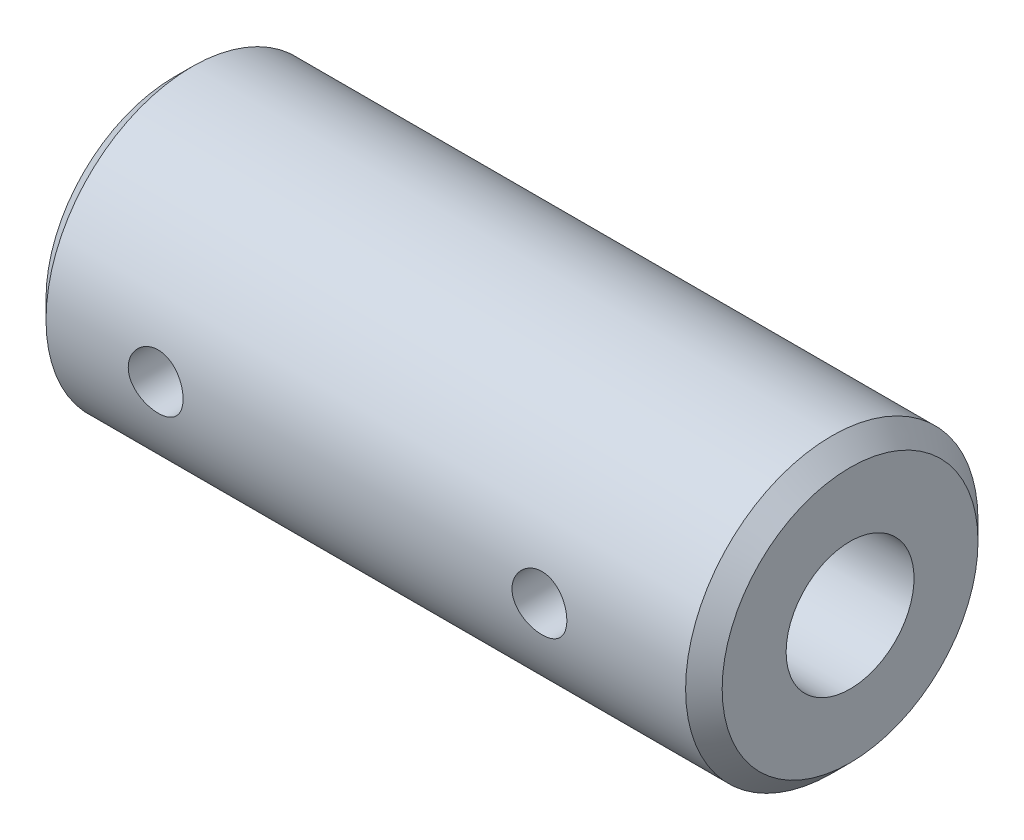
ISO-10303-21;
HEADER;
FILE_DESCRIPTION(('STEP AP214'),'2;1');
FILE_NAME('part.step','',(''),(''),'','','');
FILE_SCHEMA(('AUTOMOTIVE_DESIGN { 1 0 10303 214 1 1 1 1 }'));
ENDSEC;
DATA;
#1=APPLICATION_CONTEXT('core data for automotive mechanical design processes');
#2=APPLICATION_PROTOCOL_DEFINITION('international standard','automotive_design',2000,#1);
#3=PRODUCT_CONTEXT('',#1,'mechanical');
#4=PRODUCT('Part','Part','',(#3));
#5=PRODUCT_RELATED_PRODUCT_CATEGORY('part','',(#4));
#6=PRODUCT_DEFINITION_FORMATION('','',#4);
#7=PRODUCT_DEFINITION_CONTEXT('part definition',#1,'design');
#8=PRODUCT_DEFINITION('design','',#6,#7);
#9=PRODUCT_DEFINITION_SHAPE('','',#8);
#10=(LENGTH_UNIT() NAMED_UNIT(*) SI_UNIT(.MILLI.,.METRE.));
#11=(NAMED_UNIT(*) PLANE_ANGLE_UNIT() SI_UNIT($,.RADIAN.));
#12=(NAMED_UNIT(*) SI_UNIT($,.STERADIAN.) SOLID_ANGLE_UNIT());
#13=UNCERTAINTY_MEASURE_WITH_UNIT(LENGTH_MEASURE(1.E-05),#10,'distance_accuracy_value','');
#14=(GEOMETRIC_REPRESENTATION_CONTEXT(3) GLOBAL_UNCERTAINTY_ASSIGNED_CONTEXT((#13)) GLOBAL_UNIT_ASSIGNED_CONTEXT((#10,
#11,#12)) REPRESENTATION_CONTEXT('',''));
#15=CARTESIAN_POINT('',(0.,0.,0.));
#16=DIRECTION('',(0.,0.,1.));
#17=DIRECTION('',(1.,0.,0.));
#18=AXIS2_PLACEMENT_3D('',#15,#16,#17);
#19=CARTESIAN_POINT('',(81.9500000000005,-6.93,0.));
#20=DIRECTION('',(-1.,0.,0.));
#21=DIRECTION('',(0.,0.,1.));
#22=AXIS2_PLACEMENT_3D('',#19,#20,#21);
#23=CYLINDRICAL_SURFACE('',#22,3.5);
#24=CARTESIAN_POINT('',(118.95,-6.93,0.));
#25=DIRECTION('',(-1.,0.,0.));
#26=DIRECTION('',(0.,0.,1.));
#27=AXIS2_PLACEMENT_3D('',#24,#25,#26);
#28=CIRCLE('',#27,3.5);
#29=CARTESIAN_POINT('',(118.95,-6.93,3.5));
#30=VERTEX_POINT('',#29);
#31=EDGE_CURVE('E146',#30,#30,#28,.T.);
#32=ORIENTED_EDGE('',*,*,#31,.F.);
#33=EDGE_LOOP('',(#32));
#34=FACE_BOUND('',#33,.T.);
#35=CARTESIAN_POINT('',(102.7,-6.93,0.));
#36=DIRECTION('',(-1.,0.,0.));
#37=DIRECTION('',(0.,0.,1.));
#38=AXIS2_PLACEMENT_3D('',#35,#36,#37);
#39=CIRCLE('',#38,3.50000000000001);
#40=CARTESIAN_POINT('',(102.7,-6.93,3.50000000000001));
#41=VERTEX_POINT('',#40);
#42=EDGE_CURVE('E55',#41,#41,#39,.T.);
#43=ORIENTED_EDGE('',*,*,#42,.T.);
#44=EDGE_LOOP('',(#43));
#45=FACE_BOUND('',#44,.T.);
#46=CARTESIAN_POINT('',(111.45,-6.93,3.5));
#47=CARTESIAN_POINT('',(111.449990778561,-7.0101521976824,3.49999299268885));
#48=CARTESIAN_POINT('',(111.443537870245,-7.09041999219824,3.49721516409711));
#49=CARTESIAN_POINT('',(111.417960292715,-7.24867161136121,3.48637069204866));
#50=CARTESIAN_POINT('',(111.398803630211,-7.32664914909057,3.47829069608752));
#51=CARTESIAN_POINT('',(111.348664724801,-7.47776816474641,3.45770786336708));
#52=CARTESIAN_POINT('',(111.317723472538,-7.55092538614674,3.44522036823866));
#53=CARTESIAN_POINT('',(111.24506789625,-7.69093644607188,3.4170283792682));
#54=CARTESIAN_POINT('',(111.203356490849,-7.75779198561141,3.4013247572084));
#55=CARTESIAN_POINT('',(111.108036145875,-7.88692078354612,3.36733908702935));
#56=CARTESIAN_POINT('',(111.053952361923,-7.94882024425246,3.34896947381214));
#57=CARTESIAN_POINT('',(110.936428073884,-8.06299518436931,3.3120882776969));
#58=CARTESIAN_POINT('',(110.87298240993,-8.11526532055664,3.29357662187922));
#59=CARTESIAN_POINT('',(110.734483636294,-8.21142843548185,3.25741027462364));
#60=CARTESIAN_POINT('',(110.658994770358,-8.25473406006014,3.23985230076501));
#61=CARTESIAN_POINT('',(110.500945286533,-8.32786599574425,3.2089808436345));
#62=CARTESIAN_POINT('',(110.41838854792,-8.35769964537364,3.19566505070703));
#63=CARTESIAN_POINT('',(110.252849630691,-8.40147459991436,3.17573899533535));
#64=CARTESIAN_POINT('',(110.170096149073,-8.41613747209694,3.16882610719818));
#65=CARTESIAN_POINT('',(110.003037015233,-8.43140303570396,3.1616242484202));
#66=CARTESIAN_POINT('',(109.918732322351,-8.43201414304565,3.16133131294302));
#67=CARTESIAN_POINT('',(109.758350048152,-8.41969999758096,3.16714786968021));
#68=CARTESIAN_POINT('',(109.682164688394,-8.40788056910827,3.17273435527609));
#69=CARTESIAN_POINT('',(109.532986207111,-8.37290386406528,3.18879205821457));
#70=CARTESIAN_POINT('',(109.459993743072,-8.34974426417224,3.19926427650311));
#71=CARTESIAN_POINT('',(109.317376424263,-8.29228829534658,3.22415342810443));
#72=CARTESIAN_POINT('',(109.247859852886,-8.25775987214028,3.23865147551049));
#73=CARTESIAN_POINT('',(109.115326837971,-8.17871152436692,3.26994246945714));
#74=CARTESIAN_POINT('',(109.052313052537,-8.13418753740297,3.28673634798109));
#75=CARTESIAN_POINT('',(108.928611248188,-8.03171702696059,3.32256202266195));
#76=CARTESIAN_POINT('',(108.868641635264,-7.97292364428053,3.34165927694226));
#77=CARTESIAN_POINT('',(108.759164204673,-7.84593666202554,3.3786730287964));
#78=CARTESIAN_POINT('',(108.709659127061,-7.77774060814,3.39658921627429));
#79=CARTESIAN_POINT('',(108.621378033597,-7.63159291150633,3.4297984684468));
#80=CARTESIAN_POINT('',(108.582910490648,-7.55343557485116,3.44501227516836));
#81=CARTESIAN_POINT('',(108.519924881193,-7.39093984707949,3.47048698130307));
#82=CARTESIAN_POINT('',(108.495398647012,-7.30660510782884,3.48075078019998));
#83=CARTESIAN_POINT('',(108.462533069771,-7.14013811947069,3.49461763446686));
#84=CARTESIAN_POINT('',(108.453230617343,-7.05822898050547,3.49861624982293));
#85=CARTESIAN_POINT('',(108.448185211796,-6.89392834944074,3.50077708325871));
#86=CARTESIAN_POINT('',(108.452438073734,-6.8115370140497,3.49894110265834));
#87=CARTESIAN_POINT('',(108.473707816028,-6.6532287801867,3.48989338160076));
#88=CARTESIAN_POINT('',(108.490034160725,-6.57720053424801,3.48297259736824));
#89=CARTESIAN_POINT('',(108.534010447119,-6.42905443180369,3.46476944004987));
#90=CARTESIAN_POINT('',(108.561661797861,-6.35693706314958,3.45348652424257));
#91=CARTESIAN_POINT('',(108.628400579752,-6.21611151738101,3.42719375756865));
#92=CARTESIAN_POINT('',(108.667818165114,-6.14758012524248,3.41207852694256));
#93=CARTESIAN_POINT('',(108.756609472238,-6.01785754717483,3.37971494195702));
#94=CARTESIAN_POINT('',(108.80598744401,-5.95666951242888,3.36246567824313));
#95=CARTESIAN_POINT('',(108.917644793924,-5.83851620234367,3.32607394349024));
#96=CARTESIAN_POINT('',(108.98061610504,-5.78221691225722,3.30688677499574));
#97=CARTESIAN_POINT('',(109.115391149307,-5.68078284275599,3.2699201884485));
#98=CARTESIAN_POINT('',(109.187197330153,-5.63565116779808,3.2521411627736));
#99=CARTESIAN_POINT('',(109.339406926515,-5.55718062193616,3.21981484643716));
#100=CARTESIAN_POINT('',(109.419941504657,-5.52406792526647,3.20533127997695));
#101=CARTESIAN_POINT('',(109.586263163238,-5.47217057449108,3.18206803761104));
#102=CARTESIAN_POINT('',(109.672045498671,-5.4533731775002,3.17328328988835));
#103=CARTESIAN_POINT('',(109.838995586619,-5.43194025916096,3.16321740581936));
#104=CARTESIAN_POINT('',(109.91997963538,-5.42812653833757,3.16138962881681));
#105=CARTESIAN_POINT('',(110.081394871832,-5.43358674914209,3.16397809086752));
#106=CARTESIAN_POINT('',(110.161826154516,-5.44285837251315,3.16839322866984));
#107=CARTESIAN_POINT('',(110.315520853867,-5.47321785900563,3.18245827118031));
#108=CARTESIAN_POINT('',(110.388939416648,-5.49366517986621,3.19182357178318));
#109=CARTESIAN_POINT('',(110.531310362175,-5.54514882999564,3.2144943728719));
#110=CARTESIAN_POINT('',(110.600261468454,-5.57618816993762,3.22780099349553));
#111=CARTESIAN_POINT('',(110.736410436909,-5.65018397772979,3.25787626150962));
#112=CARTESIAN_POINT('',(110.803234893821,-5.69375972287232,3.27480834339631));
#113=CARTESIAN_POINT('',(110.928990863531,-5.79075111118695,3.30979879908541));
#114=CARTESIAN_POINT('',(110.987919377544,-5.84417047465706,3.32785759700648));
#115=CARTESIAN_POINT('',(111.101003097315,-5.96432832445824,3.36477750877144));
#116=CARTESIAN_POINT('',(111.154414733869,-6.03178518201865,3.38358948911939));
#117=CARTESIAN_POINT('',(111.249214926694,-6.17538738629306,3.41848089249469));
#118=CARTESIAN_POINT('',(111.29059803175,-6.25153665061729,3.43455907522588));
#119=CARTESIAN_POINT('',(111.359344569571,-6.40937319710343,3.46197513636855));
#120=CARTESIAN_POINT('',(111.38690352998,-6.4909635971418,3.47337868320289));
#121=CARTESIAN_POINT('',(111.427634714768,-6.65807434259566,3.49042295491409));
#122=CARTESIAN_POINT('',(111.440851509647,-6.74358164728867,3.49608152963086));
#123=CARTESIAN_POINT('',(111.448880510954,-6.86297323938678,3.49952115812386));
#124=CARTESIAN_POINT('',(111.450003856848,-6.89647650893925,3.50000293079342));
#125=CARTESIAN_POINT('',(111.45,-6.93,3.5));
#126=B_SPLINE_CURVE_WITH_KNOTS('',3,(#46,#47,#48,#49,#50,#51,#52,#53,#54,#55,#56,#57,#58,#59,
#60,#61,#62,#63,#64,#65,#66,#67,#68,#69,#70,#71,#72,#73,#74,#75,#76,#77,#78,#79,#80,#81,#82,#83,
#84,#85,#86,#87,#88,#89,#90,#91,#92,#93,#94,#95,#96,#97,#98,#99,#100,#101,#102,#103,#104,#105,
#106,#107,#108,#109,#110,#111,#112,#113,#114,#115,#116,#117,#118,#119,#120,#121,#122,#123,#124,
#125),.UNSPECIFIED.,.T.,.F.,(4,2,2,2,2,2,2,2,2,2,2,2,2,2,2,2,2,2,2,2,2,2,2,2,2,2,2,2,2,2,2,2,2,
2,2,2,2,2,2,4),(0.,0.240357161374422,0.481321951711673,0.72145613137571,0.961525304807653,
1.21311371779253,1.46484131710872,1.72984780430032,1.99470976114132,2.2462971341405,
2.49773382188956,2.72855360159806,2.95942069041214,3.19532704432401,3.43132944942383,
3.6885491885916,3.94583619550722,4.20973622296857,4.47348148178612,4.71978673747255,
4.96601595851025,5.19915597113057,5.43232499957121,5.67277527577343,5.91332836788287,
6.17201425189599,6.43077196675481,6.69417345394932,6.95734019712948,7.19934244432576,
7.44130200762142,7.67066022550941,7.90008369050322,8.14372375039556,8.38745608120074,
8.65042084666957,8.91350460007054,9.17275427816963,9.43119596989051,9.53172485598107),.UNSPECIFIED.);
#127=CARTESIAN_POINT('',(111.45,-6.93,3.5));
#128=VERTEX_POINT('',#127);
#129=EDGE_CURVE('E83',#128,#128,#126,.T.);
#130=ORIENTED_EDGE('',*,*,#129,.F.);
#131=EDGE_LOOP('',(#130));
#132=FACE_BOUND('',#131,.T.);
#133=ADVANCED_FACE('F34',(#34,#45,#132),#23,.F.);
#134=CARTESIAN_POINT('',(81.9500000000005,-6.93,0.));
#135=DIRECTION('',(-1.,0.,0.));
#136=DIRECTION('',(0.,0.,1.));
#137=AXIS2_PLACEMENT_3D('',#134,#135,#136);
#138=CYLINDRICAL_SURFACE('',#137,8.);
#139=CARTESIAN_POINT('',(82.9500000000005,-6.93,0.));
#140=DIRECTION('',(-1.,0.,0.));
#141=DIRECTION('',(0.,0.,1.));
#142=AXIS2_PLACEMENT_3D('',#139,#140,#141);
#143=CIRCLE('',#142,8.);
#144=CARTESIAN_POINT('',(82.9500000000005,-6.93,8.));
#145=VERTEX_POINT('',#144);
#146=EDGE_CURVE('E137',#145,#145,#143,.T.);
#147=ORIENTED_EDGE('',*,*,#146,.F.);
#148=EDGE_LOOP('',(#147));
#149=FACE_BOUND('',#148,.T.);
#150=CARTESIAN_POINT('',(117.95,-6.93,0.));
#151=DIRECTION('',(-1.,0.,0.));
#152=DIRECTION('',(0.,0.,1.));
#153=AXIS2_PLACEMENT_3D('',#150,#151,#152);
#154=CIRCLE('',#153,8.);
#155=CARTESIAN_POINT('',(117.95,-6.93,8.));
#156=VERTEX_POINT('',#155);
#157=EDGE_CURVE('E140',#156,#156,#154,.T.);
#158=ORIENTED_EDGE('',*,*,#157,.T.);
#159=EDGE_LOOP('',(#158));
#160=FACE_BOUND('',#159,.T.);
#161=CARTESIAN_POINT('',(108.45,-6.93,8.));
#162=CARTESIAN_POINT('',(108.450003189589,-7.01347174646547,7.99999848833852));
#163=CARTESIAN_POINT('',(108.45699107662,-7.0969849927301,7.99868009921714));
#164=CARTESIAN_POINT('',(108.484739995119,-7.2616581298418,7.9935478589052));
#165=CARTESIAN_POINT('',(108.50551265064,-7.34281597415223,7.98973190166897));
#166=CARTESIAN_POINT('',(108.56017270126,-7.5003729618518,7.98003138765458));
#167=CARTESIAN_POINT('',(108.594048252453,-7.57677633068535,7.97414869946483));
#168=CARTESIAN_POINT('',(108.673918876923,-7.72280797309401,7.96095710599783));
#169=CARTESIAN_POINT('',(108.719912969145,-7.79243679447732,7.9536483161829));
#170=CARTESIAN_POINT('',(108.823299768004,-7.9237837159305,7.93831336430504));
#171=CARTESIAN_POINT('',(108.880809444671,-7.98540895503183,7.93028034856351));
#172=CARTESIAN_POINT('',(109.005343309088,-8.09819606135369,7.9144531845865));
#173=CARTESIAN_POINT('',(109.07236817977,-8.14935717689241,7.90665905354528));
#174=CARTESIAN_POINT('',(109.214686088364,-8.24014998665793,7.89212551245005));
#175=CARTESIAN_POINT('',(109.290040370318,-8.27968721969605,7.88539493886182));
#176=CARTESIAN_POINT('',(109.446468915177,-8.34550524332283,7.87384713211987));
#177=CARTESIAN_POINT('',(109.527542684112,-8.37178717713098,7.86902973396962));
#178=CARTESIAN_POINT('',(109.692115230915,-8.410050535035,7.8619226957455));
#179=CARTESIAN_POINT('',(109.775575097204,-8.42219390192039,7.85960445366405));
#180=CARTESIAN_POINT('',(109.943377384809,-8.43233808095346,7.85767197152761));
#181=CARTESIAN_POINT('',(110.027719726303,-8.43034016135374,7.8580574889876));
#182=CARTESIAN_POINT('',(110.193719525267,-8.41238979602362,7.86146292701753));
#183=CARTESIAN_POINT('',(110.275397714301,-8.39662149996045,7.86444808147334));
#184=CARTESIAN_POINT('',(110.434928419783,-8.35186799396207,7.87266183284666));
#185=CARTESIAN_POINT('',(110.51278077351,-8.32288222239499,7.87789052509516));
#186=CARTESIAN_POINT('',(110.662988679001,-8.25233647179299,7.89003855292589));
#187=CARTESIAN_POINT('',(110.735308470581,-8.21070213532456,7.89696783823366));
#188=CARTESIAN_POINT('',(110.872004728541,-8.11609368930416,7.91172971602918));
#189=CARTESIAN_POINT('',(110.936380387715,-8.06311842889265,7.91956240015522));
#190=CARTESIAN_POINT('',(111.056424955673,-7.94633905685297,7.93540001272164));
#191=CARTESIAN_POINT('',(111.111940652452,-7.88237743686068,7.94340571024031));
#192=CARTESIAN_POINT('',(111.211477240676,-7.74596803709882,7.95857386108318));
#193=CARTESIAN_POINT('',(111.255498016871,-7.67352017225577,7.96573630595245));
#194=CARTESIAN_POINT('',(111.33081775387,-7.52203498887467,7.97842539677509));
#195=CARTESIAN_POINT('',(111.362100779118,-7.44298956444649,7.98394999136289));
#196=CARTESIAN_POINT('',(111.410902093093,-7.28063911539869,7.99272505402719));
#197=CARTESIAN_POINT('',(111.428421844046,-7.19733454427779,7.99597576367994));
#198=CARTESIAN_POINT('',(111.448986031019,-7.03014865290338,7.99980360641981));
#199=CARTESIAN_POINT('',(111.45224039153,-6.94629401263413,8.00041950912279));
#200=CARTESIAN_POINT('',(111.444744520453,-6.77923875190781,7.99901543598228));
#201=CARTESIAN_POINT('',(111.433994976935,-6.69603809951961,7.99699558964431));
#202=CARTESIAN_POINT('',(111.398970964817,-6.53331842678178,7.99057111500407));
#203=CARTESIAN_POINT('',(111.374802717463,-6.45377573895394,7.98618522374031));
#204=CARTESIAN_POINT('',(111.313742293222,-6.29987136817537,7.97551842212498));
#205=CARTESIAN_POINT('',(111.276849252435,-6.2255100374049,7.96923738311334));
#206=CARTESIAN_POINT('',(111.190921871841,-6.08318332848679,7.95538030357666));
#207=CARTESIAN_POINT('',(111.141759261464,-6.01529672298488,7.94779086174563));
#208=CARTESIAN_POINT('',(111.032861862638,-5.88866167673546,7.93219343489712));
#209=CARTESIAN_POINT('',(110.973126086999,-5.82991409023913,7.92418541084687));
#210=CARTESIAN_POINT('',(110.843827681089,-5.72242704127952,7.9085247569745));
#211=CARTESIAN_POINT('',(110.774145091875,-5.67383083781424,7.90087825860257));
#212=CARTESIAN_POINT('',(110.627482375477,-5.58903324942213,7.88692985578532));
#213=CARTESIAN_POINT('',(110.55050251963,-5.55283140386076,7.8806279013735));
#214=CARTESIAN_POINT('',(110.391794132758,-5.49405326487177,7.87013024209574));
#215=CARTESIAN_POINT('',(110.310090620441,-5.47141131205214,7.86592440436879));
#216=CARTESIAN_POINT('',(110.143952777479,-5.44019320673765,7.86007203802415));
#217=CARTESIAN_POINT('',(110.05951875603,-5.43161546729292,7.8584252206579));
#218=CARTESIAN_POINT('',(109.891751668559,-5.42882237851646,7.85789199803857));
#219=CARTESIAN_POINT('',(109.808422419043,-5.43438104996502,7.85896215974293));
#220=CARTESIAN_POINT('',(109.643908577955,-5.45920824621198,7.86364600659998));
#221=CARTESIAN_POINT('',(109.562723973573,-5.47847668910668,7.86725967655747));
#222=CARTESIAN_POINT('',(109.404925515205,-5.53008112416737,7.8766050802318));
#223=CARTESIAN_POINT('',(109.328303408655,-5.56239264602748,7.88233284594965));
#224=CARTESIAN_POINT('',(109.18153174576,-5.63914131087795,7.8952638755184));
#225=CARTESIAN_POINT('',(109.111382647156,-5.68357931051814,7.90246724360119));
#226=CARTESIAN_POINT('',(108.978416319958,-5.78410512660465,7.91767266107745));
#227=CARTESIAN_POINT('',(108.915724587433,-5.84035740135697,7.92568505353043));
#228=CARTESIAN_POINT('',(108.800594837536,-5.96257207325771,7.94152833918735));
#229=CARTESIAN_POINT('',(108.74815917902,-6.02853669810838,7.94935919027328));
#230=CARTESIAN_POINT('',(108.654589047373,-6.16901505492813,7.96403975968049));
#231=CARTESIAN_POINT('',(108.61356057151,-6.24360040935948,7.97088000990561));
#232=CARTESIAN_POINT('',(108.544682363395,-6.39870988634616,7.98271619380687));
#233=CARTESIAN_POINT('',(108.516820252954,-6.47922834829475,7.98771385879037));
#234=CARTESIAN_POINT('',(108.480722685582,-6.62165279717484,7.99428290707632));
#235=CARTESIAN_POINT('',(108.469221369688,-6.68272618974813,7.99641470878206));
#236=CARTESIAN_POINT('',(108.453858937884,-6.80585875288484,7.9992737995401));
#237=CARTESIAN_POINT('',(108.449997627745,-6.86791789834729,8.00000112429805));
#238=CARTESIAN_POINT('',(108.45,-6.93,8.));
#239=B_SPLINE_CURVE_WITH_KNOTS('',3,(#161,#162,#163,#164,#165,#166,#167,#168,#169,#170,#171,
#172,#173,#174,#175,#176,#177,#178,#179,#180,#181,#182,#183,#184,#185,#186,#187,#188,#189,#190,
#191,#192,#193,#194,#195,#196,#197,#198,#199,#200,#201,#202,#203,#204,#205,#206,#207,#208,#209,
#210,#211,#212,#213,#214,#215,#216,#217,#218,#219,#220,#221,#222,#223,#224,#225,#226,#227,#228,
#229,#230,#231,#232,#233,#234,#235,#236,#237,#238),.UNSPECIFIED.,.T.,.F.,(4,2,2,2,2,2,2,2,2,2,2,
2,2,2,2,2,2,2,2,2,2,2,2,2,2,2,2,2,2,2,2,2,2,2,2,2,2,2,4),(0.,0.250188200964927,
0.500587642535452,0.750761271230909,1.00091465336891,1.2537511801363,1.50660586283616,
1.76146190504357,2.01629596311948,2.26818151445335,2.52004447587256,2.76859000612766,
3.01714609846786,3.26719262629531,3.5172645404986,3.77127768464076,4.02529337544947,
4.27962588321697,4.53393136673745,4.78448174076096,5.03501980464582,5.28360233907827,
5.53220175338031,5.78351778017707,6.03485728413098,6.28953436987298,6.54420198954945,
6.79762627818559,7.05102196946512,7.30039252231747,7.54976158541505,7.7986649620769,
8.0475859265542,8.30023369966378,8.55293951262253,8.80792048916312,9.06266126931171,
9.24874344524407,9.43482089039539),.UNSPECIFIED.);
#240=CARTESIAN_POINT('',(108.45,-6.93,8.));
#241=VERTEX_POINT('',#240);
#242=EDGE_CURVE('E10',#241,#241,#239,.T.);
#243=ORIENTED_EDGE('',*,*,#242,.F.);
#244=EDGE_LOOP('',(#243));
#245=FACE_BOUND('',#244,.T.);
#246=CARTESIAN_POINT('',(87.4500000000005,-6.93,8.));
#247=CARTESIAN_POINT('',(87.4500031895887,-7.01347174646547,7.99999848833852));
#248=CARTESIAN_POINT('',(87.4569910766199,-7.0969849927301,7.99868009921714));
#249=CARTESIAN_POINT('',(87.4847399951188,-7.2616581298418,7.9935478589052));
#250=CARTESIAN_POINT('',(87.5055126506402,-7.34281597415223,7.98973190166897));
#251=CARTESIAN_POINT('',(87.5601727012598,-7.5003729618518,7.98003138765458));
#252=CARTESIAN_POINT('',(87.594048252453,-7.57677633068535,7.97414869946483));
#253=CARTESIAN_POINT('',(87.6739188769233,-7.72280797309401,7.96095710599783));
#254=CARTESIAN_POINT('',(87.7199129691453,-7.79243679447733,7.9536483161829));
#255=CARTESIAN_POINT('',(87.8232997680042,-7.9237837159305,7.93831336430504));
#256=CARTESIAN_POINT('',(87.8808094446706,-7.98540895503183,7.93028034856351));
#257=CARTESIAN_POINT('',(88.005343309088,-8.09819606135369,7.9144531845865));
#258=CARTESIAN_POINT('',(88.0723681797698,-8.14935717689242,7.90665905354528));
#259=CARTESIAN_POINT('',(88.2146860883645,-8.24014998665793,7.89212551245005));
#260=CARTESIAN_POINT('',(88.2900403703177,-8.27968721969605,7.88539493886182));
#261=CARTESIAN_POINT('',(88.4464689151773,-8.34550524332283,7.87384713211987));
#262=CARTESIAN_POINT('',(88.5275426841117,-8.37178717713098,7.86902973396962));
#263=CARTESIAN_POINT('',(88.6921152309149,-8.410050535035,7.8619226957455));
#264=CARTESIAN_POINT('',(88.7755750972039,-8.42219390192039,7.85960445366405));
#265=CARTESIAN_POINT('',(88.9433773848087,-8.43233808095346,7.85767197152761));
#266=CARTESIAN_POINT('',(89.0277197263028,-8.43034016135374,7.8580574889876));
#267=CARTESIAN_POINT('',(89.1937195252665,-8.41238979602362,7.86146292701753));
#268=CARTESIAN_POINT('',(89.2753977143006,-8.39662149996045,7.86444808147334));
#269=CARTESIAN_POINT('',(89.4349284197831,-8.35186799396207,7.87266183284666));
#270=CARTESIAN_POINT('',(89.5127807735098,-8.32288222239499,7.87789052509516));
#271=CARTESIAN_POINT('',(89.6629886790007,-8.25233647179299,7.89003855292588));
#272=CARTESIAN_POINT('',(89.7353084705813,-8.21070213532456,7.89696783823366));
#273=CARTESIAN_POINT('',(89.8720047285407,-8.11609368930416,7.91172971602918));
#274=CARTESIAN_POINT('',(89.9363803877153,-8.06311842889266,7.91956240015522));
#275=CARTESIAN_POINT('',(90.0564249556729,-7.94633905685297,7.93540001272164));
#276=CARTESIAN_POINT('',(90.1119406524522,-7.88237743686068,7.94340571024031));
#277=CARTESIAN_POINT('',(90.2114772406759,-7.74596803709882,7.95857386108318));
#278=CARTESIAN_POINT('',(90.2554980168709,-7.67352017225577,7.96573630595245));
#279=CARTESIAN_POINT('',(90.3308177538705,-7.52203498887467,7.97842539677509));
#280=CARTESIAN_POINT('',(90.3621007791184,-7.44298956444649,7.98394999136289));
#281=CARTESIAN_POINT('',(90.4109020930926,-7.28063911539869,7.99272505402719));
#282=CARTESIAN_POINT('',(90.4284218440458,-7.19733454427778,7.99597576367994));
#283=CARTESIAN_POINT('',(90.4489860310187,-7.03014865290338,7.99980360641981));
#284=CARTESIAN_POINT('',(90.4522403915302,-6.94629401263413,8.00041950912279));
#285=CARTESIAN_POINT('',(90.4447445204528,-6.77923875190781,7.99901543598228));
#286=CARTESIAN_POINT('',(90.4339949769352,-6.69603809951961,7.99699558964431));
#287=CARTESIAN_POINT('',(90.3989709648171,-6.53331842678178,7.99057111500407));
#288=CARTESIAN_POINT('',(90.3748027174627,-6.45377573895394,7.98618522374031));
#289=CARTESIAN_POINT('',(90.3137422932217,-6.29987136817537,7.97551842212498));
#290=CARTESIAN_POINT('',(90.2768492524347,-6.2255100374049,7.96923738311334));
#291=CARTESIAN_POINT('',(90.190921871841,-6.08318332848679,7.95538030357666));
#292=CARTESIAN_POINT('',(90.1417592614636,-6.01529672298488,7.94779086174563));
#293=CARTESIAN_POINT('',(90.0328618626381,-5.88866167673546,7.93219343489712));
#294=CARTESIAN_POINT('',(89.9731260869991,-5.82991409023913,7.92418541084687));
#295=CARTESIAN_POINT('',(89.843827681089,-5.72242704127952,7.9085247569745));
#296=CARTESIAN_POINT('',(89.7741450918751,-5.67383083781423,7.90087825860257));
#297=CARTESIAN_POINT('',(89.6274823754767,-5.58903324942213,7.88692985578532));
#298=CARTESIAN_POINT('',(89.55050251963,-5.55283140386076,7.8806279013735));
#299=CARTESIAN_POINT('',(89.3917941327579,-5.49405326487177,7.87013024209574));
#300=CARTESIAN_POINT('',(89.3100906204411,-5.47141131205214,7.86592440436879));
#301=CARTESIAN_POINT('',(89.1439527774791,-5.44019320673765,7.86007203802415));
#302=CARTESIAN_POINT('',(89.0595187560301,-5.43161546729292,7.8584252206579));
#303=CARTESIAN_POINT('',(88.891751668559,-5.42882237851646,7.85789199803857));
#304=CARTESIAN_POINT('',(88.8084224190435,-5.43438104996502,7.85896215974293));
#305=CARTESIAN_POINT('',(88.6439085779552,-5.45920824621198,7.86364600659998));
#306=CARTESIAN_POINT('',(88.562723973573,-5.47847668910668,7.86725967655747));
#307=CARTESIAN_POINT('',(88.404925515205,-5.53008112416737,7.8766050802318));
#308=CARTESIAN_POINT('',(88.3283034086547,-5.56239264602748,7.88233284594965));
#309=CARTESIAN_POINT('',(88.1815317457596,-5.63914131087795,7.8952638755184));
#310=CARTESIAN_POINT('',(88.1113826471557,-5.68357931051814,7.90246724360119));
#311=CARTESIAN_POINT('',(87.9784163199582,-5.78410512660465,7.91767266107745));
#312=CARTESIAN_POINT('',(87.9157245874334,-5.84035740135697,7.92568505353043));
#313=CARTESIAN_POINT('',(87.800594837536,-5.96257207325771,7.94152833918735));
#314=CARTESIAN_POINT('',(87.7481591790203,-6.02853669810838,7.94935919027328));
#315=CARTESIAN_POINT('',(87.6545890473734,-6.16901505492813,7.96403975968049));
#316=CARTESIAN_POINT('',(87.6135605715099,-6.24360040935948,7.97088000990561));
#317=CARTESIAN_POINT('',(87.5446823633953,-6.39870988634617,7.98271619380687));
#318=CARTESIAN_POINT('',(87.5168202529536,-6.47922834829475,7.98771385879037));
#319=CARTESIAN_POINT('',(87.4807226855818,-6.62165279717484,7.99428290707632));
#320=CARTESIAN_POINT('',(87.4692213696877,-6.68272618974813,7.99641470878206));
#321=CARTESIAN_POINT('',(87.453858937884,-6.80585875288484,7.9992737995401));
#322=CARTESIAN_POINT('',(87.4499976277446,-6.86791789834729,8.00000112429805));
#323=CARTESIAN_POINT('',(87.4500000000005,-6.93,8.));
#324=B_SPLINE_CURVE_WITH_KNOTS('',3,(#246,#247,#248,#249,#250,#251,#252,#253,#254,#255,#256,
#257,#258,#259,#260,#261,#262,#263,#264,#265,#266,#267,#268,#269,#270,#271,#272,#273,#274,#275,
#276,#277,#278,#279,#280,#281,#282,#283,#284,#285,#286,#287,#288,#289,#290,#291,#292,#293,#294,
#295,#296,#297,#298,#299,#300,#301,#302,#303,#304,#305,#306,#307,#308,#309,#310,#311,#312,#313,
#314,#315,#316,#317,#318,#319,#320,#321,#322,#323),.UNSPECIFIED.,.T.,.F.,(4,2,2,2,2,2,2,2,2,2,2,
2,2,2,2,2,2,2,2,2,2,2,2,2,2,2,2,2,2,2,2,2,2,2,2,2,2,2,4),(0.,0.250188200964925,
0.500587642535452,0.750761271230909,1.00091465336891,1.25375118013631,1.50660586283616,
1.76146190504359,2.01629596311948,2.26818151445336,2.52004447587256,2.76859000612766,
3.01714609846786,3.2671926262953,3.51726454049859,3.77127768464076,4.02529337544947,
4.27962588321698,4.53393136673745,4.78448174076096,5.03501980464582,5.28360233907827,
5.53220175338031,5.78351778017707,6.03485728413098,6.28953436987299,6.54420198954945,
6.79762627818558,7.05102196946512,7.30039252231747,7.54976158541504,7.79866496207689,
8.0475859265542,8.30023369966378,8.55293951262253,8.80792048916312,9.06266126931171,
9.24874344524407,9.43482089039538),.UNSPECIFIED.);
#325=CARTESIAN_POINT('',(87.4500000000005,-6.93,8.));
#326=VERTEX_POINT('',#325);
#327=EDGE_CURVE('E65',#326,#326,#324,.T.);
#328=ORIENTED_EDGE('',*,*,#327,.F.);
#329=EDGE_LOOP('',(#328));
#330=FACE_BOUND('',#329,.T.);
#331=ADVANCED_FACE('F89',(#149,#160,#245,#330),#138,.T.);
#332=CARTESIAN_POINT('',(81.9500000000005,-6.93,0.));
#333=DIRECTION('',(-1.,0.,0.));
#334=DIRECTION('',(0.,0.,1.));
#335=AXIS2_PLACEMENT_3D('',#332,#333,#334);
#336=CYLINDRICAL_SURFACE('',#335,3.);
#337=CARTESIAN_POINT('',(96.9500000000005,-6.93,0.));
#338=DIRECTION('',(-1.,0.,0.));
#339=DIRECTION('',(0.,0.,1.));
#340=AXIS2_PLACEMENT_3D('',#337,#338,#339);
#341=CIRCLE('',#340,3.);
#342=CARTESIAN_POINT('',(96.9500000000005,-6.93,3.));
#343=VERTEX_POINT('',#342);
#344=EDGE_CURVE('E128',#343,#343,#341,.T.);
#345=ORIENTED_EDGE('',*,*,#344,.F.);
#346=EDGE_LOOP('',(#345));
#347=FACE_BOUND('',#346,.T.);
#348=CARTESIAN_POINT('',(81.9500000000005,-6.93,0.));
#349=DIRECTION('',(-1.,0.,0.));
#350=DIRECTION('',(0.,0.,1.));
#351=AXIS2_PLACEMENT_3D('',#348,#349,#350);
#352=CIRCLE('',#351,3.);
#353=CARTESIAN_POINT('',(81.9500000000005,-6.93,3.));
#354=VERTEX_POINT('',#353);
#355=EDGE_CURVE('E129',#354,#354,#352,.T.);
#356=ORIENTED_EDGE('',*,*,#355,.T.);
#357=EDGE_LOOP('',(#356));
#358=FACE_BOUND('',#357,.T.);
#359=CARTESIAN_POINT('',(90.4500000000005,-6.93,3.));
#360=CARTESIAN_POINT('',(90.4499950465247,-7.00885794442685,2.99999570107562));
#361=CARTESIAN_POINT('',(90.4437448903189,-7.08780989954634,2.99685736529635));
#362=CARTESIAN_POINT('',(90.4190206794882,-7.24338035290334,2.98461234055736));
#363=CARTESIAN_POINT('',(90.4005234105038,-7.31999413007044,2.97549431743379));
#364=CARTESIAN_POINT('',(90.3522092870755,-7.46840031732067,2.95224419105063));
#365=CARTESIAN_POINT('',(90.3224364236285,-7.54021020440872,2.93813158766306));
#366=CARTESIAN_POINT('',(90.252644067953,-7.6777089252099,2.90618664773642));
#367=CARTESIAN_POINT('',(90.2126253836272,-7.74339824098509,2.88835460450288));
#368=CARTESIAN_POINT('',(90.1207241257725,-7.87126172664286,2.84934387387093));
#369=CARTESIAN_POINT('',(90.068270281141,-7.93298281668316,2.82802798691306));
#370=CARTESIAN_POINT('',(89.9542177811299,-8.04716916730047,2.78489955370114));
#371=CARTESIAN_POINT('',(89.8926122223418,-8.09962737466015,2.76308664313552));
#372=CARTESIAN_POINT('',(89.7562749757154,-8.19787800067541,2.71948426796021));
#373=CARTESIAN_POINT('',(89.6808958524816,-8.24283800332745,2.69782780455198));
#374=CARTESIAN_POINT('',(89.5224489960212,-8.31925234033604,2.65928968158481));
#375=CARTESIAN_POINT('',(89.4393868069164,-8.35071632244949,2.64240461410484));
#376=CARTESIAN_POINT('',(89.2730023418676,-8.39719866328288,2.61686800556713));
#377=CARTESIAN_POINT('',(89.1899933218994,-8.41308878562066,2.6077840737557));
#378=CARTESIAN_POINT('',(89.0220317433313,-8.43064048996327,2.59772834922791));
#379=CARTESIAN_POINT('',(88.9370811886937,-8.43231613255961,2.59674854014932));
#380=CARTESIAN_POINT('',(88.7785709635274,-8.42203093075844,2.60266395385872));
#381=CARTESIAN_POINT('',(88.7048639531659,-8.41167683930523,2.6086314549302));
#382=CARTESIAN_POINT('',(88.5604171359409,-8.3804097735854,2.62614343100775));
#383=CARTESIAN_POINT('',(88.4896782820425,-8.35949343584648,2.63768968247664));
#384=CARTESIAN_POINT('',(88.351156301152,-8.30731467057901,2.66531214619111));
#385=CARTESIAN_POINT('',(88.2834804018218,-8.27582260067399,2.68148760995998));
#386=CARTESIAN_POINT('',(88.1540485611155,-8.20356253150201,2.71655106422105));
#387=CARTESIAN_POINT('',(88.0922952966003,-8.1627903657187,2.73544027170286));
#388=CARTESIAN_POINT('',(87.9682181208856,-8.06709908236918,2.77669736854928));
#389=CARTESIAN_POINT('',(87.9068146896362,-8.01104168755392,2.79920265355119));
#390=CARTESIAN_POINT('',(87.7938968721141,-7.88933336811206,2.84321434950611));
#391=CARTESIAN_POINT('',(87.7423872119497,-7.82367788486143,2.86472027938201));
#392=CARTESIAN_POINT('',(87.6484715084559,-7.68077475874778,2.90552980924446));
#393=CARTESIAN_POINT('',(87.6065992913319,-7.60313038739912,2.92468476243011));
#394=CARTESIAN_POINT('',(87.536854456436,-7.4406993232332,2.95736821681863));
#395=CARTESIAN_POINT('',(87.5089707224777,-7.35591836439792,2.9709011841533));
#396=CARTESIAN_POINT('',(87.4702868944255,-7.18914973749106,2.98986500612153));
#397=CARTESIAN_POINT('',(87.4582631463803,-7.10751229582249,2.99587407451965));
#398=CARTESIAN_POINT('',(87.4478029032988,-6.94316939992403,3.00109520188655));
#399=CARTESIAN_POINT('',(87.4493599715413,-6.86046447019514,3.00031048081978));
#400=CARTESIAN_POINT('',(87.4653100326286,-6.70315054202103,2.99236788380152));
#401=CARTESIAN_POINT('',(87.4786987990955,-6.62841088792511,2.98570868532253));
#402=CARTESIAN_POINT('',(87.5163571078431,-6.4823896615471,2.96733256972261));
#403=CARTESIAN_POINT('',(87.5406278496807,-6.41110847146338,2.95561509501618));
#404=CARTESIAN_POINT('',(87.59999769965,-6.27166708732565,2.92776377120382));
#405=CARTESIAN_POINT('',(87.6353865751749,-6.20365440449131,2.91151322654447));
#406=CARTESIAN_POINT('',(87.7156613034703,-6.07430795745111,2.87615961476127));
#407=CARTESIAN_POINT('',(87.7605512018936,-6.01297705533512,2.85705533350408));
#408=CARTESIAN_POINT('',(87.8636406379965,-5.89234846606618,2.81562332004297));
#409=CARTESIAN_POINT('',(87.9227143026682,-5.83384188327147,2.79316327265249));
#410=CARTESIAN_POINT('',(88.0498877269171,-5.72721551832173,2.7489358741323));
#411=CARTESIAN_POINT('',(88.1179936782723,-5.6791029214322,2.72716901100071));
#412=CARTESIAN_POINT('',(88.2654654812599,-5.59243812828148,2.68576788309735));
#413=CARTESIAN_POINT('',(88.3452168991422,-5.55446175629964,2.66628794383592));
#414=CARTESIAN_POINT('',(88.5112651013629,-5.49287576109795,2.63361108441203));
#415=CARTESIAN_POINT('',(88.5975532897008,-5.46924762619948,2.62040607332625));
#416=CARTESIAN_POINT('',(88.7653653343275,-5.4392074687997,2.60342251538703));
#417=CARTESIAN_POINT('',(88.8465513801533,-5.43136050539183,2.59886075197598));
#418=CARTESIAN_POINT('',(89.0091706007473,-5.4289662684357,2.59748031962405));
#419=CARTESIAN_POINT('',(89.0906036531073,-5.43441323006514,2.60065829439585));
#420=CARTESIAN_POINT('',(89.2432252523006,-5.45711081161004,2.61356793076615));
#421=CARTESIAN_POINT('',(89.3146507052176,-5.47318752848545,2.62264641723988));
#422=CARTESIAN_POINT('',(89.453712179137,-5.51523696266339,2.64556524281479));
#423=CARTESIAN_POINT('',(89.5213469731385,-5.54121286326012,2.65940711354503));
#424=CARTESIAN_POINT('',(89.6559372764803,-5.60427638204916,2.69142795546804));
#425=CARTESIAN_POINT('',(89.722541852744,-5.64199329327645,2.70983583593881));
#426=CARTESIAN_POINT('',(89.8489118042724,-5.72677354254391,2.74852997452291));
#427=CARTESIAN_POINT('',(89.9086735957821,-5.77384174313766,2.76881720693416));
#428=CARTESIAN_POINT('',(90.0272129735325,-5.88269501000794,2.81193484737138));
#429=CARTESIAN_POINT('',(90.0849886535259,-5.94557336550411,2.83477474959942));
#430=CARTESIAN_POINT('',(90.1893944751534,-6.08076779065021,2.87816628389896));
#431=CARTESIAN_POINT('',(90.2360186092053,-6.15308891504221,2.89871667939293));
#432=CARTESIAN_POINT('',(90.3168545440686,-6.30610260482558,2.93547014349806));
#433=CARTESIAN_POINT('',(90.3509762538552,-6.3868507443349,2.95164144740899));
#434=CARTESIAN_POINT('',(90.4047122516366,-6.55388684829287,2.9775201194848));
#435=CARTESIAN_POINT('',(90.424367770209,-6.64015830061635,2.98724585044602));
#436=CARTESIAN_POINT('',(90.4408461166291,-6.76109708026365,2.99543192870217));
#437=CARTESIAN_POINT('',(90.4442739613,-6.79475718083765,2.99714048010376));
#438=CARTESIAN_POINT('',(90.4488519982716,-6.86227240229236,2.99942545465223));
#439=CARTESIAN_POINT('',(90.4500021277058,-6.89612752853005,3.00000184655071));
#440=CARTESIAN_POINT('',(90.4500000000005,-6.93,3.));
#441=B_SPLINE_CURVE_WITH_KNOTS('',3,(#359,#360,#361,#362,#363,#364,#365,#366,#367,#368,#369,
#370,#371,#372,#373,#374,#375,#376,#377,#378,#379,#380,#381,#382,#383,#384,#385,#386,#387,#388,
#389,#390,#391,#392,#393,#394,#395,#396,#397,#398,#399,#400,#401,#402,#403,#404,#405,#406,#407,
#408,#409,#410,#411,#412,#413,#414,#415,#416,#417,#418,#419,#420,#421,#422,#423,#424,#425,#426,
#427,#428,#429,#430,#431,#432,#433,#434,#435,#436,#437,#438,#439,#440),.UNSPECIFIED.,.T.,.F.,(4,
2,2,2,2,2,2,2,2,2,2,2,2,2,2,2,2,2,2,2,2,2,2,2,2,2,2,2,2,2,2,2,2,2,2,2,2,2,2,2,4),(0.,
0.236436386130437,0.473322224563797,0.709293233238459,0.945245640872352,1.19547263807714,
1.44588935648106,1.71572589646128,1.98536921847421,2.23887018210344,2.4921203599353,
2.7150856861398,2.93812205888517,3.16635360252729,3.39468781890332,3.65197412000818,
3.90938301898029,4.1787453332166,4.44789325368419,4.69474935707018,4.94148846767213,
5.16910359759182,5.39674382446396,5.63089284041846,5.86514176122507,6.12239415966626,
6.37982382923146,6.64972023242586,6.91926767918174,7.16293961254568,7.40650589797016,
7.62686895373283,7.84730293182525,8.0825468517043,8.31791341715445,8.58187864135756,
8.84598575071868,9.11196020495288,9.37717362931722,9.47872920200874,9.58028757766597),.UNSPECIFIED.);
#442=CARTESIAN_POINT('',(90.4500000000005,-6.93,3.));
#443=VERTEX_POINT('',#442);
#444=EDGE_CURVE('E58',#443,#443,#441,.T.);
#445=ORIENTED_EDGE('',*,*,#444,.F.);
#446=EDGE_LOOP('',(#445));
#447=FACE_BOUND('',#446,.T.);
#448=ADVANCED_FACE('F66',(#347,#358,#447),#336,.F.);
#449=CARTESIAN_POINT('',(96.9500000000005,-6.93,0.));
#450=DIRECTION('',(-1.,0.,0.));
#451=DIRECTION('',(0.,0.,1.));
#452=AXIS2_PLACEMENT_3D('',#449,#450,#451);
#453=CONICAL_SURFACE('',#452,3.,0.785398163397448);
#454=CARTESIAN_POINT('',(97.9500000000005,-6.93,0.));
#455=DIRECTION('',(-1.,0.,0.));
#456=DIRECTION('',(0.,0.,1.));
#457=AXIS2_PLACEMENT_3D('',#454,#455,#456);
#458=CIRCLE('',#457,2.);
#459=CARTESIAN_POINT('',(97.9500000000005,-6.93,2.));
#460=VERTEX_POINT('',#459);
#461=EDGE_CURVE('E46',#460,#460,#458,.T.);
#462=ORIENTED_EDGE('',*,*,#461,.F.);
#463=EDGE_LOOP('',(#462));
#464=FACE_BOUND('',#463,.T.);
#465=ORIENTED_EDGE('',*,*,#344,.T.);
#466=EDGE_LOOP('',(#465));
#467=FACE_BOUND('',#466,.T.);
#468=ADVANCED_FACE('F36',(#464,#467),#453,.F.);
#469=CARTESIAN_POINT('',(97.9500000000005,-4.93,0.));
#470=DIRECTION('',(1.,0.,0.));
#471=DIRECTION('',(0.,0.,-1.));
#472=AXIS2_PLACEMENT_3D('',#469,#470,#471);
#473=PLANE('',#472);
#474=ORIENTED_EDGE('',*,*,#461,.T.);
#475=EDGE_LOOP('',(#474));
#476=FACE_BOUND('',#475,.T.);
#477=ADVANCED_FACE('F114',(#476),#473,.F.);
#478=CARTESIAN_POINT('',(101.7,-6.93000000000001,0.));
#479=DIRECTION('',(-1.,0.,0.));
#480=DIRECTION('',(0.,0.,1.));
#481=AXIS2_PLACEMENT_3D('',#478,#479,#480);
#482=PLANE('',#481);
#483=CARTESIAN_POINT('',(101.7,-6.93,0.));
#484=DIRECTION('',(-1.,0.,0.));
#485=DIRECTION('',(0.,0.,1.));
#486=AXIS2_PLACEMENT_3D('',#483,#484,#485);
#487=CIRCLE('',#486,3.00000000000005);
#488=CARTESIAN_POINT('',(101.7,-6.93,3.00000000000005));
#489=VERTEX_POINT('',#488);
#490=EDGE_CURVE('E50',#489,#489,#487,.T.);
#491=ORIENTED_EDGE('',*,*,#490,.F.);
#492=EDGE_LOOP('',(#491));
#493=FACE_BOUND('',#492,.T.);
#494=ADVANCED_FACE('F111',(#493),#482,.F.);
#495=CARTESIAN_POINT('',(101.7,-6.93,0.));
#496=DIRECTION('',(1.,0.,0.));
#497=DIRECTION('',(0.,0.,-1.));
#498=AXIS2_PLACEMENT_3D('',#495,#496,#497);
#499=CONICAL_SURFACE('',#498,3.00000000000005,0.463647609000789);
#500=ORIENTED_EDGE('',*,*,#42,.F.);
#501=EDGE_LOOP('',(#500));
#502=FACE_BOUND('',#501,.T.);
#503=ORIENTED_EDGE('',*,*,#490,.T.);
#504=EDGE_LOOP('',(#503));
#505=FACE_BOUND('',#504,.T.);
#506=ADVANCED_FACE('F103',(#502,#505),#499,.F.);
#507=CARTESIAN_POINT('',(118.95,0.0700000000000041,0.));
#508=DIRECTION('',(-1.,0.,0.));
#509=DIRECTION('',(0.,0.,1.));
#510=AXIS2_PLACEMENT_3D('',#507,#508,#509);
#511=PLANE('',#510);
#512=CARTESIAN_POINT('',(118.95,-6.93,0.));
#513=DIRECTION('',(-1.,0.,0.));
#514=DIRECTION('',(0.,0.,1.));
#515=AXIS2_PLACEMENT_3D('',#512,#513,#514);
#516=CIRCLE('',#515,7.);
#517=CARTESIAN_POINT('',(118.95,-6.93,7.));
#518=VERTEX_POINT('',#517);
#519=EDGE_CURVE('E143',#518,#518,#516,.T.);
#520=ORIENTED_EDGE('',*,*,#519,.F.);
#521=EDGE_LOOP('',(#520));
#522=FACE_BOUND('',#521,.T.);
#523=ORIENTED_EDGE('',*,*,#31,.T.);
#524=EDGE_LOOP('',(#523));
#525=FACE_BOUND('',#524,.T.);
#526=ADVANCED_FACE('F100',(#522,#525),#511,.F.);
#527=CARTESIAN_POINT('',(118.95,-6.93,0.));
#528=DIRECTION('',(-1.,0.,0.));
#529=DIRECTION('',(0.,0.,1.));
#530=AXIS2_PLACEMENT_3D('',#527,#528,#529);
#531=CONICAL_SURFACE('',#530,7.,0.785398163397448);
#532=ORIENTED_EDGE('',*,*,#157,.F.);
#533=EDGE_LOOP('',(#532));
#534=FACE_BOUND('',#533,.T.);
#535=ORIENTED_EDGE('',*,*,#519,.T.);
#536=EDGE_LOOP('',(#535));
#537=FACE_BOUND('',#536,.T.);
#538=ADVANCED_FACE('F96',(#534,#537),#531,.T.);
#539=CARTESIAN_POINT('',(82.9500000000005,-6.93,0.));
#540=DIRECTION('',(1.,0.,0.));
#541=DIRECTION('',(0.,0.,-1.));
#542=AXIS2_PLACEMENT_3D('',#539,#540,#541);
#543=CONICAL_SURFACE('',#542,8.,0.785398163397455);
#544=CARTESIAN_POINT('',(81.9500000000005,-6.93,0.));
#545=DIRECTION('',(-1.,0.,0.));
#546=DIRECTION('',(0.,0.,1.));
#547=AXIS2_PLACEMENT_3D('',#544,#545,#546);
#548=CIRCLE('',#547,7.);
#549=CARTESIAN_POINT('',(81.9500000000005,-6.93,7.));
#550=VERTEX_POINT('',#549);
#551=EDGE_CURVE('E131',#550,#550,#548,.T.);
#552=ORIENTED_EDGE('',*,*,#551,.F.);
#553=EDGE_LOOP('',(#552));
#554=FACE_BOUND('',#553,.T.);
#555=ORIENTED_EDGE('',*,*,#146,.T.);
#556=EDGE_LOOP('',(#555));
#557=FACE_BOUND('',#556,.T.);
#558=ADVANCED_FACE('F95',(#554,#557),#543,.T.);
#559=CARTESIAN_POINT('',(81.9500000000005,-3.93,0.));
#560=DIRECTION('',(1.,0.,0.));
#561=DIRECTION('',(0.,0.,-1.));
#562=AXIS2_PLACEMENT_3D('',#559,#560,#561);
#563=PLANE('',#562);
#564=ORIENTED_EDGE('',*,*,#355,.F.);
#565=EDGE_LOOP('',(#564));
#566=FACE_BOUND('',#565,.T.);
#567=ORIENTED_EDGE('',*,*,#551,.T.);
#568=EDGE_LOOP('',(#567));
#569=FACE_BOUND('',#568,.T.);
#570=ADVANCED_FACE('F73',(#566,#569),#563,.F.);
#571=CARTESIAN_POINT('',(88.9500000000005,-6.93,8.));
#572=DIRECTION('',(0.,0.,-1.));
#573=DIRECTION('',(-1.,0.,0.));
#574=AXIS2_PLACEMENT_3D('',#571,#572,#573);
#575=CYLINDRICAL_SURFACE('',#574,1.5);
#576=ORIENTED_EDGE('',*,*,#444,.T.);
#577=EDGE_LOOP('',(#576));
#578=FACE_BOUND('',#577,.T.);
#579=ORIENTED_EDGE('',*,*,#327,.T.);
#580=EDGE_LOOP('',(#579));
#581=FACE_BOUND('',#580,.T.);
#582=ADVANCED_FACE('F69',(#578,#581),#575,.F.);
#583=CARTESIAN_POINT('',(109.95,-6.93,8.));
#584=DIRECTION('',(0.,0.,-1.));
#585=DIRECTION('',(-1.,0.,0.));
#586=AXIS2_PLACEMENT_3D('',#583,#584,#585);
#587=CYLINDRICAL_SURFACE('',#586,1.5);
#588=ORIENTED_EDGE('',*,*,#242,.T.);
#589=EDGE_LOOP('',(#588));
#590=FACE_BOUND('',#589,.T.);
#591=ORIENTED_EDGE('',*,*,#129,.T.);
#592=EDGE_LOOP('',(#591));
#593=FACE_BOUND('',#592,.T.);
#594=ADVANCED_FACE('F72',(#590,#593),#587,.F.);
#595=CLOSED_SHELL('',(#133,#331,#448,#468,#477,#494,#506,#526,#538,#558,#570,#582,#594));
#596=MANIFOLD_SOLID_BREP('B2',#595);
#597=ADVANCED_BREP_SHAPE_REPRESENTATION('',(#18,#596),#14);
#598=SHAPE_DEFINITION_REPRESENTATION(#9,#597);
ENDSEC;
END-ISO-10303-21;
